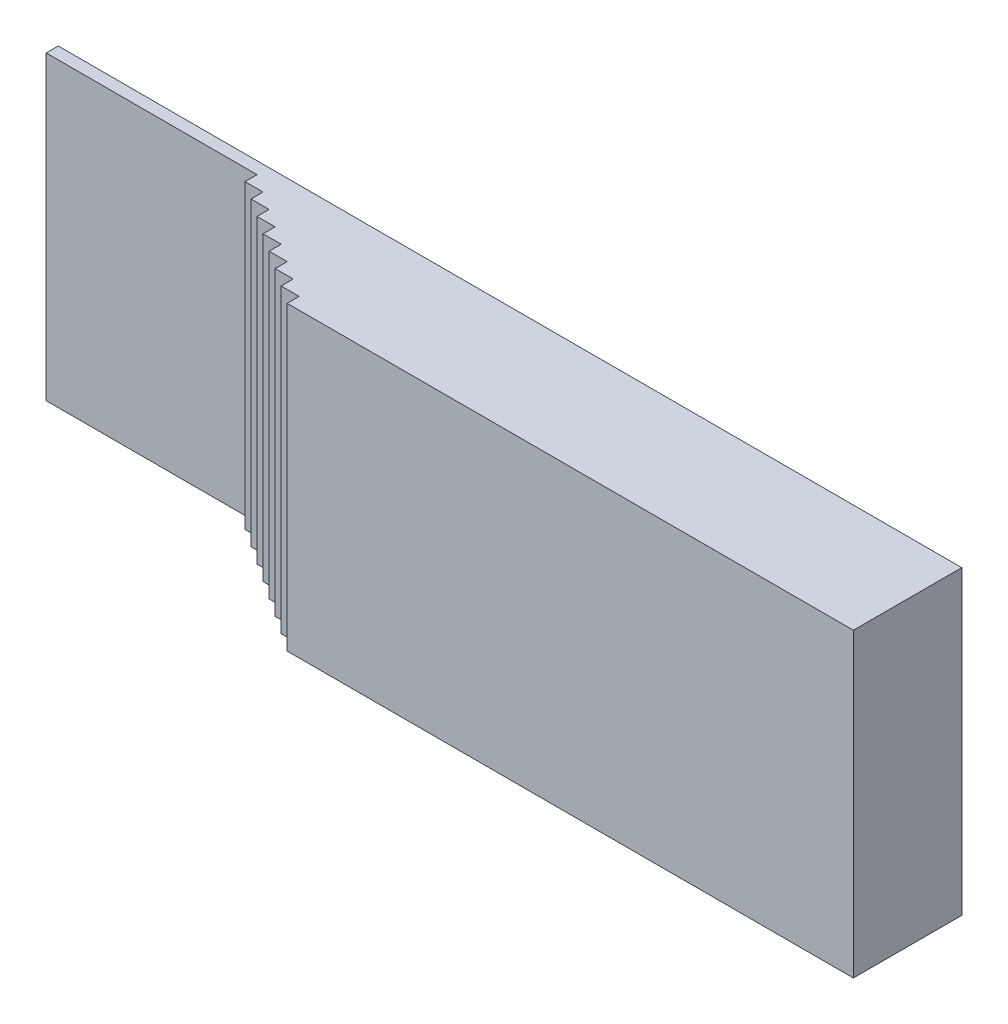
ISO-10303-21;
HEADER;
FILE_DESCRIPTION(('STEP AP214'),'2;1');
FILE_NAME('part.step','',(''),(''),'','','');
FILE_SCHEMA(('AUTOMOTIVE_DESIGN { 1 0 10303 214 1 1 1 1 }'));
ENDSEC;
DATA;
#1=APPLICATION_CONTEXT('core data for automotive mechanical design processes');
#2=APPLICATION_PROTOCOL_DEFINITION('international standard','automotive_design',2000,#1);
#3=PRODUCT_CONTEXT('',#1,'mechanical');
#4=PRODUCT('Part','Part','',(#3));
#5=PRODUCT_RELATED_PRODUCT_CATEGORY('part','',(#4));
#6=PRODUCT_DEFINITION_FORMATION('','',#4);
#7=PRODUCT_DEFINITION_CONTEXT('part definition',#1,'design');
#8=PRODUCT_DEFINITION('design','',#6,#7);
#9=PRODUCT_DEFINITION_SHAPE('','',#8);
#10=(LENGTH_UNIT() NAMED_UNIT(*) SI_UNIT(.MILLI.,.METRE.));
#11=(NAMED_UNIT(*) PLANE_ANGLE_UNIT() SI_UNIT($,.RADIAN.));
#12=(NAMED_UNIT(*) SI_UNIT($,.STERADIAN.) SOLID_ANGLE_UNIT());
#13=UNCERTAINTY_MEASURE_WITH_UNIT(LENGTH_MEASURE(1.E-05),#10,'distance_accuracy_value','');
#14=(GEOMETRIC_REPRESENTATION_CONTEXT(3) GLOBAL_UNCERTAINTY_ASSIGNED_CONTEXT((#13)) GLOBAL_UNIT_ASSIGNED_CONTEXT((#10,
#11,#12)) REPRESENTATION_CONTEXT('',''));
#15=CARTESIAN_POINT('',(0.,0.,0.));
#16=DIRECTION('',(0.,0.,1.));
#17=DIRECTION('',(1.,0.,0.));
#18=AXIS2_PLACEMENT_3D('',#15,#16,#17);
#19=CARTESIAN_POINT('',(0.,0.,200.));
#20=DIRECTION('',(0.,0.,1.));
#21=DIRECTION('',(1.,0.,0.));
#22=AXIS2_PLACEMENT_3D('',#19,#20,#21);
#23=PLANE('',#22);
#24=DIRECTION('',(1.,0.,0.));
#25=VECTOR('',#24,1.);
#26=CARTESIAN_POINT('',(-2500.,-2500.,200.));
#27=LINE('',#26,#25);
#28=CARTESIAN_POINT('',(-2500.,-2500.,200.));
#29=VERTEX_POINT('',#28);
#30=CARTESIAN_POINT('',(999.999999999999,-2500.,200.));
#31=VERTEX_POINT('',#30);
#32=EDGE_CURVE('E57',#29,#31,#27,.T.);
#33=ORIENTED_EDGE('',*,*,#32,.T.);
#34=DIRECTION('',(0.,1.,0.));
#35=VECTOR('',#34,1.);
#36=CARTESIAN_POINT('',(1000.,0.,200.));
#37=LINE('',#36,#35);
#38=CARTESIAN_POINT('',(1000.,2500.,200.));
#39=VERTEX_POINT('',#38);
#40=EDGE_CURVE('E62',#31,#39,#37,.T.);
#41=ORIENTED_EDGE('',*,*,#40,.T.);
#42=DIRECTION('',(-1.,0.,0.));
#43=VECTOR('',#42,1.);
#44=CARTESIAN_POINT('',(-2500.,2500.,200.));
#45=LINE('',#44,#43);
#46=CARTESIAN_POINT('',(-2500.,2500.,200.));
#47=VERTEX_POINT('',#46);
#48=EDGE_CURVE('E369',#39,#47,#45,.T.);
#49=ORIENTED_EDGE('',*,*,#48,.T.);
#50=DIRECTION('',(0.,-1.,0.));
#51=VECTOR('',#50,1.);
#52=CARTESIAN_POINT('',(-2500.,2500.,200.));
#53=LINE('',#52,#51);
#54=EDGE_CURVE('E372',#47,#29,#53,.T.);
#55=ORIENTED_EDGE('',*,*,#54,.T.);
#56=EDGE_LOOP('',(#33,#41,#49,#55));
#57=FACE_BOUND('',#56,.T.);
#58=ADVANCED_FACE('F41',(#57),#23,.T.);
#59=CARTESIAN_POINT('',(12500.,2500.,200.));
#60=DIRECTION('',(-1.,0.,0.));
#61=DIRECTION('',(0.,-1.,0.));
#62=AXIS2_PLACEMENT_3D('',#59,#60,#61);
#63=PLANE('',#62);
#64=DIRECTION('',(0.,1.,0.));
#65=VECTOR('',#64,1.);
#66=CARTESIAN_POINT('',(12500.,2500.,0.));
#67=LINE('',#66,#65);
#68=CARTESIAN_POINT('',(12500.,-2500.,0.));
#69=VERTEX_POINT('',#68);
#70=CARTESIAN_POINT('',(12500.,2500.,0.));
#71=VERTEX_POINT('',#70);
#72=EDGE_CURVE('E183',#69,#71,#67,.T.);
#73=ORIENTED_EDGE('',*,*,#72,.T.);
#74=DIRECTION('',(0.,0.,-1.));
#75=VECTOR('',#74,1.);
#76=CARTESIAN_POINT('',(12500.,2500.,200.));
#77=LINE('',#76,#75);
#78=CARTESIAN_POINT('',(12500.,2500.,1800.));
#79=VERTEX_POINT('',#78);
#80=EDGE_CURVE('E11',#79,#71,#77,.T.);
#81=ORIENTED_EDGE('',*,*,#80,.F.);
#82=DIRECTION('',(0.,1.,0.));
#83=VECTOR('',#82,1.);
#84=CARTESIAN_POINT('',(12500.,-2500.,1800.));
#85=LINE('',#84,#83);
#86=CARTESIAN_POINT('',(12500.,-2500.,1800.));
#87=VERTEX_POINT('',#86);
#88=EDGE_CURVE('E181',#87,#79,#85,.T.);
#89=ORIENTED_EDGE('',*,*,#88,.F.);
#90=DIRECTION('',(0.,0.,-1.));
#91=VECTOR('',#90,1.);
#92=CARTESIAN_POINT('',(12500.,-2500.,200.));
#93=LINE('',#92,#91);
#94=EDGE_CURVE('E378',#87,#69,#93,.T.);
#95=ORIENTED_EDGE('',*,*,#94,.T.);
#96=EDGE_LOOP('',(#73,#81,#89,#95));
#97=FACE_BOUND('',#96,.T.);
#98=ADVANCED_FACE('F43',(#97),#63,.F.);
#99=CARTESIAN_POINT('',(-2500.,2500.,200.));
#100=DIRECTION('',(0.,-1.,0.));
#101=DIRECTION('',(1.,0.,0.));
#102=AXIS2_PLACEMENT_3D('',#99,#100,#101);
#103=PLANE('',#102);
#104=DIRECTION('',(-1.,0.,0.));
#105=VECTOR('',#104,1.);
#106=CARTESIAN_POINT('',(-2500.,2500.,0.));
#107=LINE('',#106,#105);
#108=CARTESIAN_POINT('',(-2500.,2500.,0.));
#109=VERTEX_POINT('',#108);
#110=EDGE_CURVE('E381',#71,#109,#107,.T.);
#111=ORIENTED_EDGE('',*,*,#110,.T.);
#112=DIRECTION('',(0.,0.,-1.));
#113=VECTOR('',#112,1.);
#114=CARTESIAN_POINT('',(-2500.,2500.,200.));
#115=LINE('',#114,#113);
#116=EDGE_CURVE('E50',#47,#109,#115,.T.);
#117=ORIENTED_EDGE('',*,*,#116,.F.);
#118=ORIENTED_EDGE('',*,*,#48,.F.);
#119=DIRECTION('',(0.,0.,-1.));
#120=VECTOR('',#119,1.);
#121=CARTESIAN_POINT('',(1000.,2500.,400.));
#122=LINE('',#121,#120);
#123=CARTESIAN_POINT('',(1000.,2500.,400.));
#124=VERTEX_POINT('',#123);
#125=EDGE_CURVE('E365',#124,#39,#122,.T.);
#126=ORIENTED_EDGE('',*,*,#125,.F.);
#127=DIRECTION('',(-1.,0.,0.));
#128=VECTOR('',#127,1.);
#129=CARTESIAN_POINT('',(-1.48029736616688E-13,2500.,400.));
#130=LINE('',#129,#128);
#131=CARTESIAN_POINT('',(1300.,2500.,400.));
#132=VERTEX_POINT('',#131);
#133=EDGE_CURVE('E353',#132,#124,#130,.T.);
#134=ORIENTED_EDGE('',*,*,#133,.F.);
#135=DIRECTION('',(0.,0.,-1.));
#136=VECTOR('',#135,1.);
#137=CARTESIAN_POINT('',(1300.,2500.,600.));
#138=LINE('',#137,#136);
#139=CARTESIAN_POINT('',(1300.,2500.,600.));
#140=VERTEX_POINT('',#139);
#141=EDGE_CURVE('E342',#140,#132,#138,.T.);
#142=ORIENTED_EDGE('',*,*,#141,.F.);
#143=DIRECTION('',(-1.,0.,0.));
#144=VECTOR('',#143,1.);
#145=CARTESIAN_POINT('',(-1.48029736616688E-13,2500.,600.));
#146=LINE('',#145,#144);
#147=CARTESIAN_POINT('',(1600.,2500.,600.));
#148=VERTEX_POINT('',#147);
#149=EDGE_CURVE('E331',#148,#140,#146,.T.);
#150=ORIENTED_EDGE('',*,*,#149,.F.);
#151=DIRECTION('',(0.,0.,-1.));
#152=VECTOR('',#151,1.);
#153=CARTESIAN_POINT('',(1600.,2500.,800.));
#154=LINE('',#153,#152);
#155=CARTESIAN_POINT('',(1600.,2500.,800.));
#156=VERTEX_POINT('',#155);
#157=EDGE_CURVE('E320',#156,#148,#154,.T.);
#158=ORIENTED_EDGE('',*,*,#157,.F.);
#159=DIRECTION('',(-1.,0.,0.));
#160=VECTOR('',#159,1.);
#161=CARTESIAN_POINT('',(-1.48029736616688E-13,2500.,800.));
#162=LINE('',#161,#160);
#163=CARTESIAN_POINT('',(1900.,2500.,800.));
#164=VERTEX_POINT('',#163);
#165=EDGE_CURVE('E309',#164,#156,#162,.T.);
#166=ORIENTED_EDGE('',*,*,#165,.F.);
#167=DIRECTION('',(0.,0.,-1.));
#168=VECTOR('',#167,1.);
#169=CARTESIAN_POINT('',(1900.,2500.,1000.));
#170=LINE('',#169,#168);
#171=CARTESIAN_POINT('',(1900.,2500.,1000.));
#172=VERTEX_POINT('',#171);
#173=EDGE_CURVE('E298',#172,#164,#170,.T.);
#174=ORIENTED_EDGE('',*,*,#173,.F.);
#175=DIRECTION('',(-1.,0.,0.));
#176=VECTOR('',#175,1.);
#177=CARTESIAN_POINT('',(-1.48029736616688E-13,2500.,1000.));
#178=LINE('',#177,#176);
#179=CARTESIAN_POINT('',(2200.,2500.,1000.));
#180=VERTEX_POINT('',#179);
#181=EDGE_CURVE('E287',#180,#172,#178,.T.);
#182=ORIENTED_EDGE('',*,*,#181,.F.);
#183=DIRECTION('',(0.,0.,-1.));
#184=VECTOR('',#183,1.);
#185=CARTESIAN_POINT('',(2200.,2500.,1200.));
#186=LINE('',#185,#184);
#187=CARTESIAN_POINT('',(2200.,2500.,1200.));
#188=VERTEX_POINT('',#187);
#189=EDGE_CURVE('E276',#188,#180,#186,.T.);
#190=ORIENTED_EDGE('',*,*,#189,.F.);
#191=DIRECTION('',(-1.,0.,0.));
#192=VECTOR('',#191,1.);
#193=CARTESIAN_POINT('',(-1.48029736616688E-13,2500.,1200.));
#194=LINE('',#193,#192);
#195=CARTESIAN_POINT('',(2500.,2500.,1200.));
#196=VERTEX_POINT('',#195);
#197=EDGE_CURVE('E265',#196,#188,#194,.T.);
#198=ORIENTED_EDGE('',*,*,#197,.F.);
#199=DIRECTION('',(0.,0.,-1.));
#200=VECTOR('',#199,1.);
#201=CARTESIAN_POINT('',(2500.,2500.,1400.));
#202=LINE('',#201,#200);
#203=CARTESIAN_POINT('',(2500.,2500.,1400.));
#204=VERTEX_POINT('',#203);
#205=EDGE_CURVE('E254',#204,#196,#202,.T.);
#206=ORIENTED_EDGE('',*,*,#205,.F.);
#207=DIRECTION('',(-1.,0.,0.));
#208=VECTOR('',#207,1.);
#209=CARTESIAN_POINT('',(-1.48029736616688E-13,2500.,1400.));
#210=LINE('',#209,#208);
#211=CARTESIAN_POINT('',(2800.,2500.,1400.));
#212=VERTEX_POINT('',#211);
#213=EDGE_CURVE('E243',#212,#204,#210,.T.);
#214=ORIENTED_EDGE('',*,*,#213,.F.);
#215=DIRECTION('',(0.,0.,-1.));
#216=VECTOR('',#215,1.);
#217=CARTESIAN_POINT('',(2800.,2500.,1600.));
#218=LINE('',#217,#216);
#219=CARTESIAN_POINT('',(2800.,2500.,1600.));
#220=VERTEX_POINT('',#219);
#221=EDGE_CURVE('E232',#220,#212,#218,.T.);
#222=ORIENTED_EDGE('',*,*,#221,.F.);
#223=DIRECTION('',(-1.,0.,0.));
#224=VECTOR('',#223,1.);
#225=CARTESIAN_POINT('',(-1.48029736616688E-13,2500.,1600.));
#226=LINE('',#225,#224);
#227=CARTESIAN_POINT('',(3100.,2500.,1600.));
#228=VERTEX_POINT('',#227);
#229=EDGE_CURVE('E221',#228,#220,#226,.T.);
#230=ORIENTED_EDGE('',*,*,#229,.F.);
#231=DIRECTION('',(0.,0.,-1.));
#232=VECTOR('',#231,1.);
#233=CARTESIAN_POINT('',(3100.,2500.,1800.));
#234=LINE('',#233,#232);
#235=CARTESIAN_POINT('',(3100.,2500.,1800.));
#236=VERTEX_POINT('',#235);
#237=EDGE_CURVE('E189',#236,#228,#234,.T.);
#238=ORIENTED_EDGE('',*,*,#237,.F.);
#239=DIRECTION('',(-1.,0.,0.));
#240=VECTOR('',#239,1.);
#241=CARTESIAN_POINT('',(-1.48029736616688E-13,2500.,1800.));
#242=LINE('',#241,#240);
#243=EDGE_CURVE('E186',#79,#236,#242,.T.);
#244=ORIENTED_EDGE('',*,*,#243,.F.);
#245=ORIENTED_EDGE('',*,*,#80,.T.);
#246=EDGE_LOOP('',(#111,#117,#118,#126,#134,#142,#150,#158,#166,#174,#182,#190,#198,#206,#214,
#222,#230,#238,#244,#245));
#247=FACE_BOUND('',#246,.T.);
#248=ADVANCED_FACE('F187',(#247),#103,.F.);
#249=CARTESIAN_POINT('',(-2500.,2500.,200.));
#250=DIRECTION('',(1.,0.,0.));
#251=DIRECTION('',(0.,1.,0.));
#252=AXIS2_PLACEMENT_3D('',#249,#250,#251);
#253=PLANE('',#252);
#254=DIRECTION('',(0.,-1.,0.));
#255=VECTOR('',#254,1.);
#256=CARTESIAN_POINT('',(-2500.,2500.,0.));
#257=LINE('',#256,#255);
#258=CARTESIAN_POINT('',(-2500.,-2500.,0.));
#259=VERTEX_POINT('',#258);
#260=EDGE_CURVE('E384',#109,#259,#257,.T.);
#261=ORIENTED_EDGE('',*,*,#260,.T.);
#262=DIRECTION('',(0.,0.,-1.));
#263=VECTOR('',#262,1.);
#264=CARTESIAN_POINT('',(-2500.,-2500.,200.));
#265=LINE('',#264,#263);
#266=EDGE_CURVE('E391',#29,#259,#265,.T.);
#267=ORIENTED_EDGE('',*,*,#266,.F.);
#268=ORIENTED_EDGE('',*,*,#54,.F.);
#269=ORIENTED_EDGE('',*,*,#116,.T.);
#270=EDGE_LOOP('',(#261,#267,#268,#269));
#271=FACE_BOUND('',#270,.T.);
#272=ADVANCED_FACE('F400',(#271),#253,.F.);
#273=CARTESIAN_POINT('',(-2500.,-2500.,200.));
#274=DIRECTION('',(0.,1.,0.));
#275=DIRECTION('',(-1.,0.,0.));
#276=AXIS2_PLACEMENT_3D('',#273,#274,#275);
#277=PLANE('',#276);
#278=ORIENTED_EDGE('',*,*,#94,.F.);
#279=DIRECTION('',(1.,0.,0.));
#280=VECTOR('',#279,1.);
#281=CARTESIAN_POINT('',(1.48029736616687E-13,-2500.,1800.));
#282=LINE('',#281,#280);
#283=CARTESIAN_POINT('',(3100.,-2500.,1800.));
#284=VERTEX_POINT('',#283);
#285=EDGE_CURVE('E195',#284,#87,#282,.T.);
#286=ORIENTED_EDGE('',*,*,#285,.F.);
#287=DIRECTION('',(0.,0.,-1.));
#288=VECTOR('',#287,1.);
#289=CARTESIAN_POINT('',(3100.,-2500.,1800.));
#290=LINE('',#289,#288);
#291=CARTESIAN_POINT('',(3100.,-2500.,1600.));
#292=VERTEX_POINT('',#291);
#293=EDGE_CURVE('E207',#284,#292,#290,.T.);
#294=ORIENTED_EDGE('',*,*,#293,.T.);
#295=DIRECTION('',(1.,0.,0.));
#296=VECTOR('',#295,1.);
#297=CARTESIAN_POINT('',(1.48029736616687E-13,-2500.,1600.));
#298=LINE('',#297,#296);
#299=CARTESIAN_POINT('',(2800.,-2500.,1600.));
#300=VERTEX_POINT('',#299);
#301=EDGE_CURVE('E213',#300,#292,#298,.T.);
#302=ORIENTED_EDGE('',*,*,#301,.F.);
#303=DIRECTION('',(0.,0.,-1.));
#304=VECTOR('',#303,1.);
#305=CARTESIAN_POINT('',(2800.,-2500.,1600.));
#306=LINE('',#305,#304);
#307=CARTESIAN_POINT('',(2800.,-2500.,1400.));
#308=VERTEX_POINT('',#307);
#309=EDGE_CURVE('E228',#300,#308,#306,.T.);
#310=ORIENTED_EDGE('',*,*,#309,.T.);
#311=DIRECTION('',(1.,0.,0.));
#312=VECTOR('',#311,1.);
#313=CARTESIAN_POINT('',(1.48029736616687E-13,-2500.,1400.));
#314=LINE('',#313,#312);
#315=CARTESIAN_POINT('',(2500.,-2500.,1400.));
#316=VERTEX_POINT('',#315);
#317=EDGE_CURVE('E235',#316,#308,#314,.T.);
#318=ORIENTED_EDGE('',*,*,#317,.F.);
#319=DIRECTION('',(0.,0.,-1.));
#320=VECTOR('',#319,1.);
#321=CARTESIAN_POINT('',(2500.,-2500.,1400.));
#322=LINE('',#321,#320);
#323=CARTESIAN_POINT('',(2500.,-2500.,1200.));
#324=VERTEX_POINT('',#323);
#325=EDGE_CURVE('E250',#316,#324,#322,.T.);
#326=ORIENTED_EDGE('',*,*,#325,.T.);
#327=DIRECTION('',(1.,0.,0.));
#328=VECTOR('',#327,1.);
#329=CARTESIAN_POINT('',(1.48029736616687E-13,-2500.,1200.));
#330=LINE('',#329,#328);
#331=CARTESIAN_POINT('',(2200.,-2500.,1200.));
#332=VERTEX_POINT('',#331);
#333=EDGE_CURVE('E257',#332,#324,#330,.T.);
#334=ORIENTED_EDGE('',*,*,#333,.F.);
#335=DIRECTION('',(0.,0.,-1.));
#336=VECTOR('',#335,1.);
#337=CARTESIAN_POINT('',(2200.,-2500.,1200.));
#338=LINE('',#337,#336);
#339=CARTESIAN_POINT('',(2200.,-2500.,1000.));
#340=VERTEX_POINT('',#339);
#341=EDGE_CURVE('E272',#332,#340,#338,.T.);
#342=ORIENTED_EDGE('',*,*,#341,.T.);
#343=DIRECTION('',(1.,0.,0.));
#344=VECTOR('',#343,1.);
#345=CARTESIAN_POINT('',(1.48029736616687E-13,-2500.,1000.));
#346=LINE('',#345,#344);
#347=CARTESIAN_POINT('',(1900.,-2500.,1000.));
#348=VERTEX_POINT('',#347);
#349=EDGE_CURVE('E279',#348,#340,#346,.T.);
#350=ORIENTED_EDGE('',*,*,#349,.F.);
#351=DIRECTION('',(0.,0.,-1.));
#352=VECTOR('',#351,1.);
#353=CARTESIAN_POINT('',(1900.,-2500.,1000.));
#354=LINE('',#353,#352);
#355=CARTESIAN_POINT('',(1900.,-2500.,800.));
#356=VERTEX_POINT('',#355);
#357=EDGE_CURVE('E294',#348,#356,#354,.T.);
#358=ORIENTED_EDGE('',*,*,#357,.T.);
#359=DIRECTION('',(1.,0.,0.));
#360=VECTOR('',#359,1.);
#361=CARTESIAN_POINT('',(1.48029736616687E-13,-2500.,800.));
#362=LINE('',#361,#360);
#363=CARTESIAN_POINT('',(1600.,-2500.,800.));
#364=VERTEX_POINT('',#363);
#365=EDGE_CURVE('E301',#364,#356,#362,.T.);
#366=ORIENTED_EDGE('',*,*,#365,.F.);
#367=DIRECTION('',(0.,0.,-1.));
#368=VECTOR('',#367,1.);
#369=CARTESIAN_POINT('',(1600.,-2500.,800.));
#370=LINE('',#369,#368);
#371=CARTESIAN_POINT('',(1600.,-2500.,600.));
#372=VERTEX_POINT('',#371);
#373=EDGE_CURVE('E316',#364,#372,#370,.T.);
#374=ORIENTED_EDGE('',*,*,#373,.T.);
#375=DIRECTION('',(1.,0.,0.));
#376=VECTOR('',#375,1.);
#377=CARTESIAN_POINT('',(1.48029736616687E-13,-2500.,600.));
#378=LINE('',#377,#376);
#379=CARTESIAN_POINT('',(1300.,-2500.,600.));
#380=VERTEX_POINT('',#379);
#381=EDGE_CURVE('E323',#380,#372,#378,.T.);
#382=ORIENTED_EDGE('',*,*,#381,.F.);
#383=DIRECTION('',(0.,0.,-1.));
#384=VECTOR('',#383,1.);
#385=CARTESIAN_POINT('',(1300.,-2500.,600.));
#386=LINE('',#385,#384);
#387=CARTESIAN_POINT('',(1300.,-2500.,400.));
#388=VERTEX_POINT('',#387);
#389=EDGE_CURVE('E338',#380,#388,#386,.T.);
#390=ORIENTED_EDGE('',*,*,#389,.T.);
#391=DIRECTION('',(1.,0.,0.));
#392=VECTOR('',#391,1.);
#393=CARTESIAN_POINT('',(1.48029736616687E-13,-2500.,400.));
#394=LINE('',#393,#392);
#395=CARTESIAN_POINT('',(1000.,-2500.,400.));
#396=VERTEX_POINT('',#395);
#397=EDGE_CURVE('E345',#396,#388,#394,.T.);
#398=ORIENTED_EDGE('',*,*,#397,.F.);
#399=DIRECTION('',(0.,0.,-1.));
#400=VECTOR('',#399,1.);
#401=CARTESIAN_POINT('',(1000.,-2500.,400.));
#402=LINE('',#401,#400);
#403=EDGE_CURVE('E360',#396,#31,#402,.T.);
#404=ORIENTED_EDGE('',*,*,#403,.T.);
#405=ORIENTED_EDGE('',*,*,#32,.F.);
#406=ORIENTED_EDGE('',*,*,#266,.T.);
#407=DIRECTION('',(1.,0.,0.));
#408=VECTOR('',#407,1.);
#409=CARTESIAN_POINT('',(-2500.,-2500.,0.));
#410=LINE('',#409,#408);
#411=EDGE_CURVE('E373',#259,#69,#410,.T.);
#412=ORIENTED_EDGE('',*,*,#411,.T.);
#413=EDGE_LOOP('',(#278,#286,#294,#302,#310,#318,#326,#334,#342,#350,#358,#366,#374,#382,#390,
#398,#404,#405,#406,#412));
#414=FACE_BOUND('',#413,.T.);
#415=ADVANCED_FACE('F406',(#414),#277,.F.);
#416=CARTESIAN_POINT('',(0.,0.,0.));
#417=DIRECTION('',(0.,0.,1.));
#418=DIRECTION('',(1.,0.,0.));
#419=AXIS2_PLACEMENT_3D('',#416,#417,#418);
#420=PLANE('',#419);
#421=ORIENTED_EDGE('',*,*,#72,.F.);
#422=ORIENTED_EDGE('',*,*,#411,.F.);
#423=ORIENTED_EDGE('',*,*,#260,.F.);
#424=ORIENTED_EDGE('',*,*,#110,.F.);
#425=EDGE_LOOP('',(#421,#422,#423,#424));
#426=FACE_BOUND('',#425,.T.);
#427=ADVANCED_FACE('F404',(#426),#420,.F.);
#428=CARTESIAN_POINT('',(1000.,0.,400.));
#429=DIRECTION('',(-1.,0.,0.));
#430=DIRECTION('',(0.,0.,1.));
#431=AXIS2_PLACEMENT_3D('',#428,#429,#430);
#432=PLANE('',#431);
#433=ORIENTED_EDGE('',*,*,#40,.F.);
#434=ORIENTED_EDGE('',*,*,#403,.F.);
#435=DIRECTION('',(0.,1.,0.));
#436=VECTOR('',#435,1.);
#437=CARTESIAN_POINT('',(1000.,0.,400.));
#438=LINE('',#437,#436);
#439=EDGE_CURVE('E356',#396,#124,#438,.T.);
#440=ORIENTED_EDGE('',*,*,#439,.T.);
#441=ORIENTED_EDGE('',*,*,#125,.T.);
#442=EDGE_LOOP('',(#433,#434,#440,#441));
#443=FACE_BOUND('',#442,.T.);
#444=ADVANCED_FACE('F410',(#443),#432,.T.);
#445=CARTESIAN_POINT('',(0.,0.,400.));
#446=DIRECTION('',(0.,0.,1.));
#447=DIRECTION('',(1.,0.,0.));
#448=AXIS2_PLACEMENT_3D('',#445,#446,#447);
#449=PLANE('',#448);
#450=ORIENTED_EDGE('',*,*,#397,.T.);
#451=DIRECTION('',(0.,1.,0.));
#452=VECTOR('',#451,1.);
#453=CARTESIAN_POINT('',(1300.,0.,400.));
#454=LINE('',#453,#452);
#455=EDGE_CURVE('E349',#388,#132,#454,.T.);
#456=ORIENTED_EDGE('',*,*,#455,.T.);
#457=ORIENTED_EDGE('',*,*,#133,.T.);
#458=ORIENTED_EDGE('',*,*,#439,.F.);
#459=EDGE_LOOP('',(#450,#456,#457,#458));
#460=FACE_BOUND('',#459,.T.);
#461=ADVANCED_FACE('F451',(#460),#449,.T.);
#462=CARTESIAN_POINT('',(1300.,0.,600.));
#463=DIRECTION('',(-1.,0.,0.));
#464=DIRECTION('',(0.,0.,1.));
#465=AXIS2_PLACEMENT_3D('',#462,#463,#464);
#466=PLANE('',#465);
#467=ORIENTED_EDGE('',*,*,#141,.T.);
#468=ORIENTED_EDGE('',*,*,#455,.F.);
#469=ORIENTED_EDGE('',*,*,#389,.F.);
#470=DIRECTION('',(0.,1.,0.));
#471=VECTOR('',#470,1.);
#472=CARTESIAN_POINT('',(1300.,0.,600.));
#473=LINE('',#472,#471);
#474=EDGE_CURVE('E334',#380,#140,#473,.T.);
#475=ORIENTED_EDGE('',*,*,#474,.T.);
#476=EDGE_LOOP('',(#467,#468,#469,#475));
#477=FACE_BOUND('',#476,.T.);
#478=ADVANCED_FACE('F457',(#477),#466,.T.);
#479=CARTESIAN_POINT('',(0.,0.,600.));
#480=DIRECTION('',(0.,0.,1.));
#481=DIRECTION('',(1.,0.,0.));
#482=AXIS2_PLACEMENT_3D('',#479,#480,#481);
#483=PLANE('',#482);
#484=ORIENTED_EDGE('',*,*,#381,.T.);
#485=DIRECTION('',(0.,1.,0.));
#486=VECTOR('',#485,1.);
#487=CARTESIAN_POINT('',(1600.,0.,600.));
#488=LINE('',#487,#486);
#489=EDGE_CURVE('E327',#372,#148,#488,.T.);
#490=ORIENTED_EDGE('',*,*,#489,.T.);
#491=ORIENTED_EDGE('',*,*,#149,.T.);
#492=ORIENTED_EDGE('',*,*,#474,.F.);
#493=EDGE_LOOP('',(#484,#490,#491,#492));
#494=FACE_BOUND('',#493,.T.);
#495=ADVANCED_FACE('F464',(#494),#483,.T.);
#496=CARTESIAN_POINT('',(1600.,0.,800.));
#497=DIRECTION('',(-1.,0.,0.));
#498=DIRECTION('',(0.,0.,1.));
#499=AXIS2_PLACEMENT_3D('',#496,#497,#498);
#500=PLANE('',#499);
#501=ORIENTED_EDGE('',*,*,#157,.T.);
#502=ORIENTED_EDGE('',*,*,#489,.F.);
#503=ORIENTED_EDGE('',*,*,#373,.F.);
#504=DIRECTION('',(0.,1.,0.));
#505=VECTOR('',#504,1.);
#506=CARTESIAN_POINT('',(1600.,0.,800.));
#507=LINE('',#506,#505);
#508=EDGE_CURVE('E312',#364,#156,#507,.T.);
#509=ORIENTED_EDGE('',*,*,#508,.T.);
#510=EDGE_LOOP('',(#501,#502,#503,#509));
#511=FACE_BOUND('',#510,.T.);
#512=ADVANCED_FACE('F472',(#511),#500,.T.);
#513=CARTESIAN_POINT('',(0.,0.,800.));
#514=DIRECTION('',(0.,0.,1.));
#515=DIRECTION('',(1.,0.,0.));
#516=AXIS2_PLACEMENT_3D('',#513,#514,#515);
#517=PLANE('',#516);
#518=ORIENTED_EDGE('',*,*,#365,.T.);
#519=DIRECTION('',(0.,1.,0.));
#520=VECTOR('',#519,1.);
#521=CARTESIAN_POINT('',(1900.,0.,800.));
#522=LINE('',#521,#520);
#523=EDGE_CURVE('E305',#356,#164,#522,.T.);
#524=ORIENTED_EDGE('',*,*,#523,.T.);
#525=ORIENTED_EDGE('',*,*,#165,.T.);
#526=ORIENTED_EDGE('',*,*,#508,.F.);
#527=EDGE_LOOP('',(#518,#524,#525,#526));
#528=FACE_BOUND('',#527,.T.);
#529=ADVANCED_FACE('F480',(#528),#517,.T.);
#530=CARTESIAN_POINT('',(1900.,0.,1000.));
#531=DIRECTION('',(-1.,0.,0.));
#532=DIRECTION('',(0.,0.,1.));
#533=AXIS2_PLACEMENT_3D('',#530,#531,#532);
#534=PLANE('',#533);
#535=ORIENTED_EDGE('',*,*,#173,.T.);
#536=ORIENTED_EDGE('',*,*,#523,.F.);
#537=ORIENTED_EDGE('',*,*,#357,.F.);
#538=DIRECTION('',(0.,1.,0.));
#539=VECTOR('',#538,1.);
#540=CARTESIAN_POINT('',(1900.,0.,1000.));
#541=LINE('',#540,#539);
#542=EDGE_CURVE('E290',#348,#172,#541,.T.);
#543=ORIENTED_EDGE('',*,*,#542,.T.);
#544=EDGE_LOOP('',(#535,#536,#537,#543));
#545=FACE_BOUND('',#544,.T.);
#546=ADVANCED_FACE('F488',(#545),#534,.T.);
#547=CARTESIAN_POINT('',(0.,0.,1000.));
#548=DIRECTION('',(0.,0.,1.));
#549=DIRECTION('',(1.,0.,0.));
#550=AXIS2_PLACEMENT_3D('',#547,#548,#549);
#551=PLANE('',#550);
#552=ORIENTED_EDGE('',*,*,#349,.T.);
#553=DIRECTION('',(0.,1.,0.));
#554=VECTOR('',#553,1.);
#555=CARTESIAN_POINT('',(2200.,0.,1000.));
#556=LINE('',#555,#554);
#557=EDGE_CURVE('E283',#340,#180,#556,.T.);
#558=ORIENTED_EDGE('',*,*,#557,.T.);
#559=ORIENTED_EDGE('',*,*,#181,.T.);
#560=ORIENTED_EDGE('',*,*,#542,.F.);
#561=EDGE_LOOP('',(#552,#558,#559,#560));
#562=FACE_BOUND('',#561,.T.);
#563=ADVANCED_FACE('F496',(#562),#551,.T.);
#564=CARTESIAN_POINT('',(2200.,0.,1200.));
#565=DIRECTION('',(-1.,0.,0.));
#566=DIRECTION('',(0.,0.,1.));
#567=AXIS2_PLACEMENT_3D('',#564,#565,#566);
#568=PLANE('',#567);
#569=ORIENTED_EDGE('',*,*,#189,.T.);
#570=ORIENTED_EDGE('',*,*,#557,.F.);
#571=ORIENTED_EDGE('',*,*,#341,.F.);
#572=DIRECTION('',(0.,1.,0.));
#573=VECTOR('',#572,1.);
#574=CARTESIAN_POINT('',(2200.,0.,1200.));
#575=LINE('',#574,#573);
#576=EDGE_CURVE('E268',#332,#188,#575,.T.);
#577=ORIENTED_EDGE('',*,*,#576,.T.);
#578=EDGE_LOOP('',(#569,#570,#571,#577));
#579=FACE_BOUND('',#578,.T.);
#580=ADVANCED_FACE('F504',(#579),#568,.T.);
#581=CARTESIAN_POINT('',(0.,0.,1200.));
#582=DIRECTION('',(0.,0.,1.));
#583=DIRECTION('',(1.,0.,0.));
#584=AXIS2_PLACEMENT_3D('',#581,#582,#583);
#585=PLANE('',#584);
#586=ORIENTED_EDGE('',*,*,#333,.T.);
#587=DIRECTION('',(0.,1.,0.));
#588=VECTOR('',#587,1.);
#589=CARTESIAN_POINT('',(2500.,0.,1200.));
#590=LINE('',#589,#588);
#591=EDGE_CURVE('E261',#324,#196,#590,.T.);
#592=ORIENTED_EDGE('',*,*,#591,.T.);
#593=ORIENTED_EDGE('',*,*,#197,.T.);
#594=ORIENTED_EDGE('',*,*,#576,.F.);
#595=EDGE_LOOP('',(#586,#592,#593,#594));
#596=FACE_BOUND('',#595,.T.);
#597=ADVANCED_FACE('F512',(#596),#585,.T.);
#598=CARTESIAN_POINT('',(2500.,0.,1400.));
#599=DIRECTION('',(-1.,0.,0.));
#600=DIRECTION('',(0.,0.,1.));
#601=AXIS2_PLACEMENT_3D('',#598,#599,#600);
#602=PLANE('',#601);
#603=ORIENTED_EDGE('',*,*,#205,.T.);
#604=ORIENTED_EDGE('',*,*,#591,.F.);
#605=ORIENTED_EDGE('',*,*,#325,.F.);
#606=DIRECTION('',(0.,1.,0.));
#607=VECTOR('',#606,1.);
#608=CARTESIAN_POINT('',(2500.,0.,1400.));
#609=LINE('',#608,#607);
#610=EDGE_CURVE('E246',#316,#204,#609,.T.);
#611=ORIENTED_EDGE('',*,*,#610,.T.);
#612=EDGE_LOOP('',(#603,#604,#605,#611));
#613=FACE_BOUND('',#612,.T.);
#614=ADVANCED_FACE('F520',(#613),#602,.T.);
#615=CARTESIAN_POINT('',(0.,0.,1400.));
#616=DIRECTION('',(0.,0.,1.));
#617=DIRECTION('',(1.,0.,0.));
#618=AXIS2_PLACEMENT_3D('',#615,#616,#617);
#619=PLANE('',#618);
#620=ORIENTED_EDGE('',*,*,#317,.T.);
#621=DIRECTION('',(0.,1.,0.));
#622=VECTOR('',#621,1.);
#623=CARTESIAN_POINT('',(2800.,0.,1400.));
#624=LINE('',#623,#622);
#625=EDGE_CURVE('E239',#308,#212,#624,.T.);
#626=ORIENTED_EDGE('',*,*,#625,.T.);
#627=ORIENTED_EDGE('',*,*,#213,.T.);
#628=ORIENTED_EDGE('',*,*,#610,.F.);
#629=EDGE_LOOP('',(#620,#626,#627,#628));
#630=FACE_BOUND('',#629,.T.);
#631=ADVANCED_FACE('F528',(#630),#619,.T.);
#632=CARTESIAN_POINT('',(2800.,0.,1600.));
#633=DIRECTION('',(-1.,0.,0.));
#634=DIRECTION('',(0.,0.,1.));
#635=AXIS2_PLACEMENT_3D('',#632,#633,#634);
#636=PLANE('',#635);
#637=ORIENTED_EDGE('',*,*,#221,.T.);
#638=ORIENTED_EDGE('',*,*,#625,.F.);
#639=ORIENTED_EDGE('',*,*,#309,.F.);
#640=DIRECTION('',(0.,1.,0.));
#641=VECTOR('',#640,1.);
#642=CARTESIAN_POINT('',(2800.,0.,1600.));
#643=LINE('',#642,#641);
#644=EDGE_CURVE('E224',#300,#220,#643,.T.);
#645=ORIENTED_EDGE('',*,*,#644,.T.);
#646=EDGE_LOOP('',(#637,#638,#639,#645));
#647=FACE_BOUND('',#646,.T.);
#648=ADVANCED_FACE('F536',(#647),#636,.T.);
#649=CARTESIAN_POINT('',(0.,0.,1600.));
#650=DIRECTION('',(0.,0.,1.));
#651=DIRECTION('',(1.,0.,0.));
#652=AXIS2_PLACEMENT_3D('',#649,#650,#651);
#653=PLANE('',#652);
#654=ORIENTED_EDGE('',*,*,#301,.T.);
#655=DIRECTION('',(0.,1.,0.));
#656=VECTOR('',#655,1.);
#657=CARTESIAN_POINT('',(3100.,0.,1600.));
#658=LINE('',#657,#656);
#659=EDGE_CURVE('E217',#292,#228,#658,.T.);
#660=ORIENTED_EDGE('',*,*,#659,.T.);
#661=ORIENTED_EDGE('',*,*,#229,.T.);
#662=ORIENTED_EDGE('',*,*,#644,.F.);
#663=EDGE_LOOP('',(#654,#660,#661,#662));
#664=FACE_BOUND('',#663,.T.);
#665=ADVANCED_FACE('F544',(#664),#653,.T.);
#666=CARTESIAN_POINT('',(3100.,0.,1800.));
#667=DIRECTION('',(-1.,0.,0.));
#668=DIRECTION('',(0.,0.,1.));
#669=AXIS2_PLACEMENT_3D('',#666,#667,#668);
#670=PLANE('',#669);
#671=ORIENTED_EDGE('',*,*,#237,.T.);
#672=ORIENTED_EDGE('',*,*,#659,.F.);
#673=ORIENTED_EDGE('',*,*,#293,.F.);
#674=DIRECTION('',(0.,1.,0.));
#675=VECTOR('',#674,1.);
#676=CARTESIAN_POINT('',(3100.,0.,1800.));
#677=LINE('',#676,#675);
#678=EDGE_CURVE('E194',#284,#236,#677,.T.);
#679=ORIENTED_EDGE('',*,*,#678,.T.);
#680=EDGE_LOOP('',(#671,#672,#673,#679));
#681=FACE_BOUND('',#680,.T.);
#682=ADVANCED_FACE('F552',(#681),#670,.T.);
#683=CARTESIAN_POINT('',(0.,0.,1800.));
#684=DIRECTION('',(0.,0.,1.));
#685=DIRECTION('',(1.,0.,0.));
#686=AXIS2_PLACEMENT_3D('',#683,#684,#685);
#687=PLANE('',#686);
#688=ORIENTED_EDGE('',*,*,#285,.T.);
#689=ORIENTED_EDGE('',*,*,#88,.T.);
#690=ORIENTED_EDGE('',*,*,#243,.T.);
#691=ORIENTED_EDGE('',*,*,#678,.F.);
#692=EDGE_LOOP('',(#688,#689,#690,#691));
#693=FACE_BOUND('',#692,.T.);
#694=ADVANCED_FACE('F198',(#693),#687,.T.);
#695=CLOSED_SHELL('',(#58,#98,#248,#272,#415,#427,#444,#461,#478,#495,#512,#529,#546,#563,#580,
#597,#614,#631,#648,#665,#682,#694));
#696=MANIFOLD_SOLID_BREP('B2',#695);
#697=ADVANCED_BREP_SHAPE_REPRESENTATION('',(#18,#696),#14);
#698=SHAPE_DEFINITION_REPRESENTATION(#9,#697);
ENDSEC;
END-ISO-10303-21;
